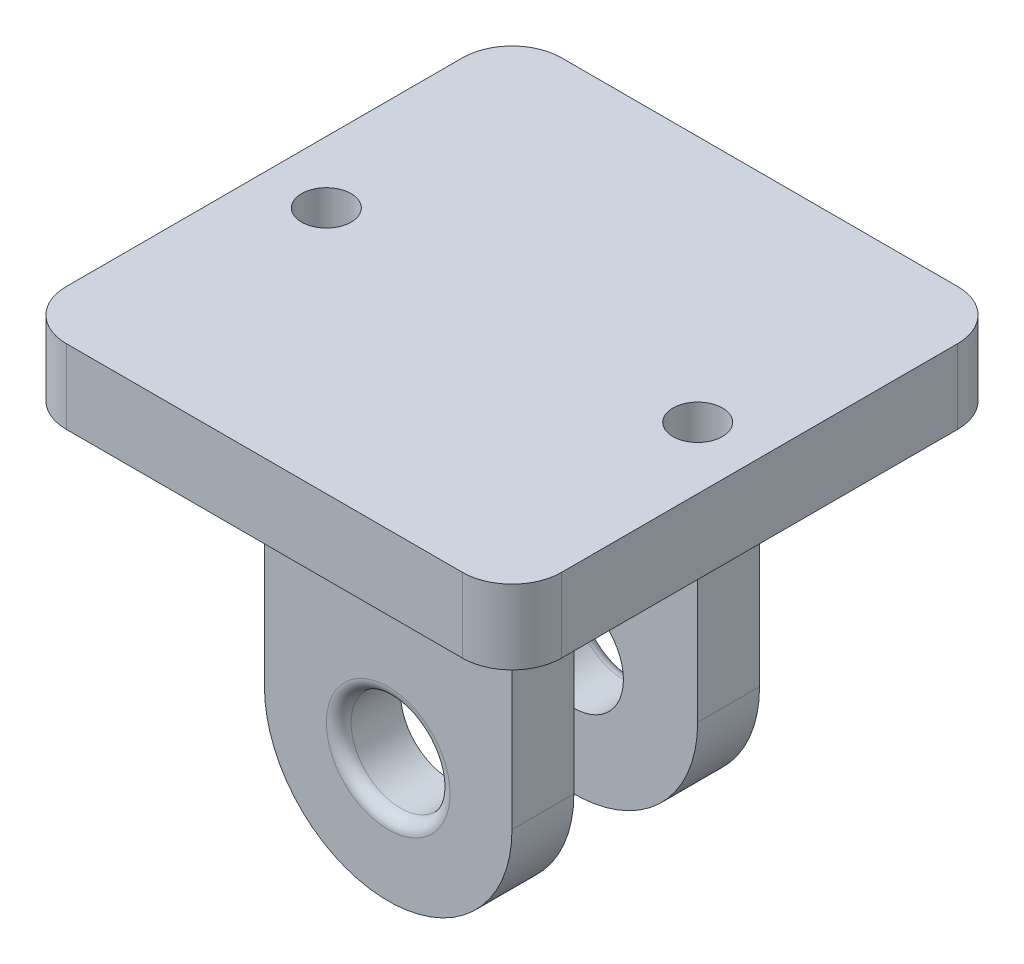
ISO-10303-21;
HEADER;
FILE_DESCRIPTION(('STEP AP214'),'2;1');
FILE_NAME('part.step','',(''),(''),'','','');
FILE_SCHEMA(('AUTOMOTIVE_DESIGN { 1 0 10303 214 1 1 1 1 }'));
ENDSEC;
DATA;
#1=APPLICATION_CONTEXT('core data for automotive mechanical design processes');
#2=APPLICATION_PROTOCOL_DEFINITION('international standard','automotive_design',2000,#1);
#3=PRODUCT_CONTEXT('',#1,'mechanical');
#4=PRODUCT('Part','Part','',(#3));
#5=PRODUCT_RELATED_PRODUCT_CATEGORY('part','',(#4));
#6=PRODUCT_DEFINITION_FORMATION('','',#4);
#7=PRODUCT_DEFINITION_CONTEXT('part definition',#1,'design');
#8=PRODUCT_DEFINITION('design','',#6,#7);
#9=PRODUCT_DEFINITION_SHAPE('','',#8);
#10=(LENGTH_UNIT() NAMED_UNIT(*) SI_UNIT(.MILLI.,.METRE.));
#11=(NAMED_UNIT(*) PLANE_ANGLE_UNIT() SI_UNIT($,.RADIAN.));
#12=(NAMED_UNIT(*) SI_UNIT($,.STERADIAN.) SOLID_ANGLE_UNIT());
#13=UNCERTAINTY_MEASURE_WITH_UNIT(LENGTH_MEASURE(1.E-05),#10,'distance_accuracy_value','');
#14=(GEOMETRIC_REPRESENTATION_CONTEXT(3) GLOBAL_UNCERTAINTY_ASSIGNED_CONTEXT((#13)) GLOBAL_UNIT_ASSIGNED_CONTEXT((#10,
#11,#12)) REPRESENTATION_CONTEXT('',''));
#15=CARTESIAN_POINT('',(0.,0.,0.));
#16=DIRECTION('',(0.,0.,1.));
#17=DIRECTION('',(1.,0.,0.));
#18=AXIS2_PLACEMENT_3D('',#15,#16,#17);
#19=CARTESIAN_POINT('',(0.,-2.49999999999999,0.));
#20=DIRECTION('',(0.,0.,-1.));
#21=DIRECTION('',(-1.,0.,0.));
#22=AXIS2_PLACEMENT_3D('',#19,#20,#21);
#23=CYLINDRICAL_SURFACE('',#22,5.);
#24=CARTESIAN_POINT('',(0.,-2.49999999999999,7.5));
#25=DIRECTION('',(0.,0.,1.));
#26=DIRECTION('',(0.,-1.,0.));
#27=AXIS2_PLACEMENT_3D('',#24,#25,#26);
#28=CIRCLE('',#27,5.);
#29=CARTESIAN_POINT('',(5.,-2.49999999999999,7.5));
#30=VERTEX_POINT('',#29);
#31=CARTESIAN_POINT('',(-5.,-2.49999999999999,7.5));
#32=VERTEX_POINT('',#31);
#33=EDGE_CURVE('E215',#30,#32,#28,.F.);
#34=ORIENTED_EDGE('',*,*,#33,.F.);
#35=DIRECTION('',(0.,0.,-1.));
#36=VECTOR('',#35,1.);
#37=CARTESIAN_POINT('',(5.,-2.49999999999999,10.));
#38=LINE('',#37,#36);
#39=CARTESIAN_POINT('',(5.,-2.49999999999999,10.));
#40=VERTEX_POINT('',#39);
#41=EDGE_CURVE('E230',#40,#30,#38,.T.);
#42=ORIENTED_EDGE('',*,*,#41,.F.);
#43=CARTESIAN_POINT('',(0.,-2.49999999999999,10.));
#44=DIRECTION('',(0.,0.,1.));
#45=DIRECTION('',(1.,0.,0.));
#46=AXIS2_PLACEMENT_3D('',#43,#44,#45);
#47=CIRCLE('',#46,5.);
#48=CARTESIAN_POINT('',(-5.,-2.49999999999999,10.));
#49=VERTEX_POINT('',#48);
#50=EDGE_CURVE('E236',#49,#40,#47,.T.);
#51=ORIENTED_EDGE('',*,*,#50,.F.);
#52=DIRECTION('',(0.,0.,-1.));
#53=VECTOR('',#52,1.);
#54=CARTESIAN_POINT('',(-5.,-2.49999999999999,10.));
#55=LINE('',#54,#53);
#56=EDGE_CURVE('E223',#32,#49,#55,.F.);
#57=ORIENTED_EDGE('',*,*,#56,.F.);
#58=EDGE_LOOP('',(#34,#42,#51,#57));
#59=FACE_BOUND('',#58,.T.);
#60=ADVANCED_FACE('F39',(#59),#23,.T.);
#61=CARTESIAN_POINT('',(0.,-2.49999999999999,2.5));
#62=DIRECTION('',(0.,0.,-1.));
#63=DIRECTION('',(0.,1.,0.));
#64=AXIS2_PLACEMENT_3D('',#61,#62,#63);
#65=CIRCLE('',#64,5.);
#66=CARTESIAN_POINT('',(-5.,-2.5,2.5));
#67=VERTEX_POINT('',#66);
#68=CARTESIAN_POINT('',(5.,-2.5,2.5));
#69=VERTEX_POINT('',#68);
#70=EDGE_CURVE('E212',#67,#69,#65,.F.);
#71=ORIENTED_EDGE('',*,*,#70,.F.);
#72=CARTESIAN_POINT('',(-5.,-2.49999999999999,0.));
#73=VERTEX_POINT('',#72);
#74=EDGE_CURVE('E226',#73,#67,#55,.F.);
#75=ORIENTED_EDGE('',*,*,#74,.F.);
#76=CARTESIAN_POINT('',(0.,-2.49999999999999,0.));
#77=DIRECTION('',(0.,0.,1.));
#78=DIRECTION('',(1.,0.,0.));
#79=AXIS2_PLACEMENT_3D('',#76,#77,#78);
#80=CIRCLE('',#79,5.);
#81=CARTESIAN_POINT('',(5.,-2.49999999999999,0.));
#82=VERTEX_POINT('',#81);
#83=EDGE_CURVE('E233',#82,#73,#80,.F.);
#84=ORIENTED_EDGE('',*,*,#83,.F.);
#85=EDGE_CURVE('E229',#69,#82,#38,.T.);
#86=ORIENTED_EDGE('',*,*,#85,.F.);
#87=EDGE_LOOP('',(#71,#75,#84,#86));
#88=FACE_BOUND('',#87,.T.);
#89=ADVANCED_FACE('F308',(#88),#23,.T.);
#90=CARTESIAN_POINT('',(5.,7.5,10.));
#91=DIRECTION('',(-1.,0.,0.));
#92=DIRECTION('',(0.,-1.,0.));
#93=AXIS2_PLACEMENT_3D('',#90,#91,#92);
#94=PLANE('',#93);
#95=DIRECTION('',(0.,1.,0.));
#96=VECTOR('',#95,1.);
#97=CARTESIAN_POINT('',(5.,7.5,0.));
#98=LINE('',#97,#96);
#99=CARTESIAN_POINT('',(5.,7.,0.));
#100=VERTEX_POINT('',#99);
#101=EDGE_CURVE('E217',#82,#100,#98,.T.);
#102=ORIENTED_EDGE('',*,*,#101,.T.);
#103=DIRECTION('',(0.,0.,-1.));
#104=VECTOR('',#103,1.);
#105=CARTESIAN_POINT('',(5.,7.,10.));
#106=LINE('',#105,#104);
#107=CARTESIAN_POINT('',(5.,7.,10.));
#108=VERTEX_POINT('',#107);
#109=EDGE_CURVE('E48',#100,#108,#106,.F.);
#110=ORIENTED_EDGE('',*,*,#109,.T.);
#111=DIRECTION('',(0.,1.,0.));
#112=VECTOR('',#111,1.);
#113=CARTESIAN_POINT('',(5.,7.5,10.));
#114=LINE('',#113,#112);
#115=EDGE_CURVE('E218',#40,#108,#114,.T.);
#116=ORIENTED_EDGE('',*,*,#115,.F.);
#117=ORIENTED_EDGE('',*,*,#41,.T.);
#118=DIRECTION('',(0.,1.,0.));
#119=VECTOR('',#118,1.);
#120=CARTESIAN_POINT('',(5.,4.5,7.5));
#121=LINE('',#120,#119);
#122=CARTESIAN_POINT('',(5.,4.5,7.5));
#123=VERTEX_POINT('',#122);
#124=EDGE_CURVE('E199',#30,#123,#121,.T.);
#125=ORIENTED_EDGE('',*,*,#124,.T.);
#126=DIRECTION('',(0.,0.,-1.));
#127=VECTOR('',#126,1.);
#128=CARTESIAN_POINT('',(5.,4.5,2.5));
#129=LINE('',#128,#127);
#130=CARTESIAN_POINT('',(5.,4.5,2.5));
#131=VERTEX_POINT('',#130);
#132=EDGE_CURVE('E202',#123,#131,#129,.T.);
#133=ORIENTED_EDGE('',*,*,#132,.T.);
#134=DIRECTION('',(0.,-1.,0.));
#135=VECTOR('',#134,1.);
#136=CARTESIAN_POINT('',(5.,4.5,2.5));
#137=LINE('',#136,#135);
#138=EDGE_CURVE('E205',#131,#69,#137,.T.);
#139=ORIENTED_EDGE('',*,*,#138,.T.);
#140=ORIENTED_EDGE('',*,*,#85,.T.);
#141=EDGE_LOOP('',(#102,#110,#116,#117,#125,#133,#139,#140));
#142=FACE_BOUND('',#141,.T.);
#143=ADVANCED_FACE('F327',(#142),#94,.F.);
#144=CARTESIAN_POINT('',(-5.,7.5,10.));
#145=DIRECTION('',(1.,0.,0.));
#146=DIRECTION('',(0.,1.,0.));
#147=AXIS2_PLACEMENT_3D('',#144,#145,#146);
#148=PLANE('',#147);
#149=DIRECTION('',(0.,-1.,0.));
#150=VECTOR('',#149,1.);
#151=CARTESIAN_POINT('',(-5.,7.5,10.));
#152=LINE('',#151,#150);
#153=CARTESIAN_POINT('',(-5.,7.,10.));
#154=VERTEX_POINT('',#153);
#155=EDGE_CURVE('E220',#154,#49,#152,.T.);
#156=ORIENTED_EDGE('',*,*,#155,.F.);
#157=DIRECTION('',(0.,0.,-1.));
#158=VECTOR('',#157,1.);
#159=CARTESIAN_POINT('',(-5.,7.,0.));
#160=LINE('',#159,#158);
#161=CARTESIAN_POINT('',(-5.,7.,0.));
#162=VERTEX_POINT('',#161);
#163=EDGE_CURVE('E257',#154,#162,#160,.T.);
#164=ORIENTED_EDGE('',*,*,#163,.T.);
#165=DIRECTION('',(0.,-1.,0.));
#166=VECTOR('',#165,1.);
#167=CARTESIAN_POINT('',(-5.,7.5,0.));
#168=LINE('',#167,#166);
#169=EDGE_CURVE('E221',#162,#73,#168,.T.);
#170=ORIENTED_EDGE('',*,*,#169,.T.);
#171=ORIENTED_EDGE('',*,*,#74,.T.);
#172=DIRECTION('',(0.,-1.,0.));
#173=VECTOR('',#172,1.);
#174=CARTESIAN_POINT('',(-5.,4.5,2.5));
#175=LINE('',#174,#173);
#176=CARTESIAN_POINT('',(-5.,4.5,2.5));
#177=VERTEX_POINT('',#176);
#178=EDGE_CURVE('E193',#177,#67,#175,.T.);
#179=ORIENTED_EDGE('',*,*,#178,.F.);
#180=DIRECTION('',(0.,0.,-1.));
#181=VECTOR('',#180,1.);
#182=CARTESIAN_POINT('',(-5.,4.5,2.5));
#183=LINE('',#182,#181);
#184=CARTESIAN_POINT('',(-5.,4.5,7.5));
#185=VERTEX_POINT('',#184);
#186=EDGE_CURVE('E190',#185,#177,#183,.T.);
#187=ORIENTED_EDGE('',*,*,#186,.F.);
#188=DIRECTION('',(0.,-1.,0.));
#189=VECTOR('',#188,1.);
#190=CARTESIAN_POINT('',(-5.,7.5,7.5));
#191=LINE('',#190,#189);
#192=EDGE_CURVE('E238',#185,#32,#191,.T.);
#193=ORIENTED_EDGE('',*,*,#192,.T.);
#194=ORIENTED_EDGE('',*,*,#56,.T.);
#195=EDGE_LOOP('',(#156,#164,#170,#171,#179,#187,#193,#194));
#196=FACE_BOUND('',#195,.T.);
#197=ADVANCED_FACE('F300',(#196),#148,.F.);
#198=CARTESIAN_POINT('',(0.,0.,10.));
#199=DIRECTION('',(0.,0.,1.));
#200=DIRECTION('',(1.,0.,0.));
#201=AXIS2_PLACEMENT_3D('',#198,#199,#200);
#202=PLANE('',#201);
#203=CARTESIAN_POINT('',(0.,-2.49999999999999,10.));
#204=DIRECTION('',(0.,0.,1.));
#205=DIRECTION('',(1.,0.,0.));
#206=AXIS2_PLACEMENT_3D('',#203,#204,#205);
#207=CIRCLE('',#206,2.5);
#208=CARTESIAN_POINT('',(2.5,-2.49999999999999,10.));
#209=VERTEX_POINT('',#208);
#210=EDGE_CURVE('E248',#209,#209,#207,.F.);
#211=ORIENTED_EDGE('',*,*,#210,.T.);
#212=EDGE_LOOP('',(#211));
#213=FACE_BOUND('',#212,.T.);
#214=ORIENTED_EDGE('',*,*,#115,.T.);
#215=DIRECTION('',(-1.,0.,0.));
#216=VECTOR('',#215,1.);
#217=CARTESIAN_POINT('',(0.,7.,10.));
#218=LINE('',#217,#216);
#219=EDGE_CURVE('E269',#108,#154,#218,.T.);
#220=ORIENTED_EDGE('',*,*,#219,.T.);
#221=ORIENTED_EDGE('',*,*,#155,.T.);
#222=ORIENTED_EDGE('',*,*,#50,.T.);
#223=EDGE_LOOP('',(#214,#220,#221,#222));
#224=FACE_BOUND('',#223,.T.);
#225=ADVANCED_FACE('F326',(#213,#224),#202,.T.);
#226=CARTESIAN_POINT('',(0.,0.,0.));
#227=DIRECTION('',(0.,0.,1.));
#228=DIRECTION('',(1.,0.,0.));
#229=AXIS2_PLACEMENT_3D('',#226,#227,#228);
#230=PLANE('',#229);
#231=CARTESIAN_POINT('',(0.,-2.49999999999999,0.));
#232=DIRECTION('',(0.,0.,1.));
#233=DIRECTION('',(1.,0.,0.));
#234=AXIS2_PLACEMENT_3D('',#231,#232,#233);
#235=CIRCLE('',#234,2.5);
#236=CARTESIAN_POINT('',(2.5,-2.49999999999999,0.));
#237=VERTEX_POINT('',#236);
#238=EDGE_CURVE('E251',#237,#237,#235,.T.);
#239=ORIENTED_EDGE('',*,*,#238,.T.);
#240=EDGE_LOOP('',(#239));
#241=FACE_BOUND('',#240,.T.);
#242=ORIENTED_EDGE('',*,*,#169,.F.);
#243=DIRECTION('',(-1.,0.,0.));
#244=VECTOR('',#243,1.);
#245=CARTESIAN_POINT('',(5.,7.,0.));
#246=LINE('',#245,#244);
#247=EDGE_CURVE('E11',#162,#100,#246,.F.);
#248=ORIENTED_EDGE('',*,*,#247,.T.);
#249=ORIENTED_EDGE('',*,*,#101,.F.);
#250=ORIENTED_EDGE('',*,*,#83,.T.);
#251=EDGE_LOOP('',(#242,#248,#249,#250));
#252=FACE_BOUND('',#251,.T.);
#253=ADVANCED_FACE('F302',(#241,#252),#230,.F.);
#254=CARTESIAN_POINT('',(5.,4.5,7.5));
#255=DIRECTION('',(0.,0.,1.));
#256=DIRECTION('',(0.,-1.,0.));
#257=AXIS2_PLACEMENT_3D('',#254,#255,#256);
#258=PLANE('',#257);
#259=CARTESIAN_POINT('',(0.,-2.49999999999999,7.5));
#260=DIRECTION('',(0.,0.,1.));
#261=DIRECTION('',(0.,-1.,0.));
#262=AXIS2_PLACEMENT_3D('',#259,#260,#261);
#263=CIRCLE('',#262,2.);
#264=CARTESIAN_POINT('',(2.,-2.49999999999999,7.50000000000001));
#265=VERTEX_POINT('',#264);
#266=EDGE_CURVE('E245',#265,#265,#263,.T.);
#267=ORIENTED_EDGE('',*,*,#266,.T.);
#268=EDGE_LOOP('',(#267));
#269=FACE_BOUND('',#268,.T.);
#270=ORIENTED_EDGE('',*,*,#33,.T.);
#271=ORIENTED_EDGE('',*,*,#192,.F.);
#272=DIRECTION('',(-1.,0.,0.));
#273=VECTOR('',#272,1.);
#274=CARTESIAN_POINT('',(5.,4.5,7.5));
#275=LINE('',#274,#273);
#276=EDGE_CURVE('E207',#123,#185,#275,.T.);
#277=ORIENTED_EDGE('',*,*,#276,.F.);
#278=ORIENTED_EDGE('',*,*,#124,.F.);
#279=EDGE_LOOP('',(#270,#271,#277,#278));
#280=FACE_BOUND('',#279,.T.);
#281=ADVANCED_FACE('F320',(#269,#280),#258,.F.);
#282=CARTESIAN_POINT('',(5.,4.5,2.5));
#283=DIRECTION('',(0.,0.,-1.));
#284=DIRECTION('',(0.,1.,0.));
#285=AXIS2_PLACEMENT_3D('',#282,#283,#284);
#286=PLANE('',#285);
#287=CARTESIAN_POINT('',(0.,-2.49999999999999,2.5));
#288=DIRECTION('',(0.,0.,-1.));
#289=DIRECTION('',(0.,1.,0.));
#290=AXIS2_PLACEMENT_3D('',#287,#288,#289);
#291=CIRCLE('',#290,2.);
#292=CARTESIAN_POINT('',(2.,-2.49999999999999,2.5));
#293=VERTEX_POINT('',#292);
#294=EDGE_CURVE('E242',#293,#293,#291,.T.);
#295=ORIENTED_EDGE('',*,*,#294,.T.);
#296=EDGE_LOOP('',(#295));
#297=FACE_BOUND('',#296,.T.);
#298=ORIENTED_EDGE('',*,*,#70,.T.);
#299=ORIENTED_EDGE('',*,*,#138,.F.);
#300=DIRECTION('',(-1.,0.,0.));
#301=VECTOR('',#300,1.);
#302=CARTESIAN_POINT('',(5.,4.5,2.5));
#303=LINE('',#302,#301);
#304=EDGE_CURVE('E210',#131,#177,#303,.T.);
#305=ORIENTED_EDGE('',*,*,#304,.T.);
#306=ORIENTED_EDGE('',*,*,#178,.T.);
#307=EDGE_LOOP('',(#298,#299,#305,#306));
#308=FACE_BOUND('',#307,.T.);
#309=ADVANCED_FACE('F312',(#297,#308),#286,.F.);
#310=CARTESIAN_POINT('',(5.,4.5,2.5));
#311=DIRECTION('',(0.,1.,0.));
#312=DIRECTION('',(-1.,0.,0.));
#313=AXIS2_PLACEMENT_3D('',#310,#311,#312);
#314=PLANE('',#313);
#315=ORIENTED_EDGE('',*,*,#186,.T.);
#316=ORIENTED_EDGE('',*,*,#304,.F.);
#317=ORIENTED_EDGE('',*,*,#132,.F.);
#318=ORIENTED_EDGE('',*,*,#276,.T.);
#319=EDGE_LOOP('',(#315,#316,#317,#318));
#320=FACE_BOUND('',#319,.T.);
#321=ADVANCED_FACE('F316',(#320),#314,.F.);
#322=CARTESIAN_POINT('',(0.,7.5,0.));
#323=DIRECTION('',(0.,1.,0.));
#324=DIRECTION('',(0.,0.,1.));
#325=AXIS2_PLACEMENT_3D('',#322,#323,#324);
#326=PLANE('',#325);
#327=DIRECTION('',(-1.,0.,0.));
#328=VECTOR('',#327,1.);
#329=CARTESIAN_POINT('',(-5.,7.5,-0.5));
#330=LINE('',#329,#328);
#331=CARTESIAN_POINT('',(5.5,7.5,-0.5));
#332=VERTEX_POINT('',#331);
#333=CARTESIAN_POINT('',(-5.5,7.5,-0.5));
#334=VERTEX_POINT('',#333);
#335=EDGE_CURVE('E260',#332,#334,#330,.T.);
#336=ORIENTED_EDGE('',*,*,#335,.T.);
#337=DIRECTION('',(0.,0.,-1.));
#338=VECTOR('',#337,1.);
#339=CARTESIAN_POINT('',(-5.5,7.5,10.));
#340=LINE('',#339,#338);
#341=CARTESIAN_POINT('',(-5.5,7.5,10.5));
#342=VERTEX_POINT('',#341);
#343=EDGE_CURVE('E266',#334,#342,#340,.F.);
#344=ORIENTED_EDGE('',*,*,#343,.T.);
#345=DIRECTION('',(-1.,0.,0.));
#346=VECTOR('',#345,1.);
#347=CARTESIAN_POINT('',(0.,7.5,10.5));
#348=LINE('',#347,#346);
#349=CARTESIAN_POINT('',(5.5,7.5,10.5));
#350=VERTEX_POINT('',#349);
#351=EDGE_CURVE('E264',#342,#350,#348,.F.);
#352=ORIENTED_EDGE('',*,*,#351,.T.);
#353=DIRECTION('',(0.,0.,-1.));
#354=VECTOR('',#353,1.);
#355=CARTESIAN_POINT('',(5.5,7.5,0.));
#356=LINE('',#355,#354);
#357=EDGE_CURVE('E262',#350,#332,#356,.T.);
#358=ORIENTED_EDGE('',*,*,#357,.T.);
#359=EDGE_LOOP('',(#336,#344,#352,#358));
#360=FACE_BOUND('',#359,.T.);
#361=CARTESIAN_POINT('',(-7.5,7.5,5.));
#362=DIRECTION('',(0.,-1.,0.));
#363=DIRECTION('',(0.,0.,-1.));
#364=AXIS2_PLACEMENT_3D('',#361,#362,#363);
#365=CIRCLE('',#364,1.);
#366=CARTESIAN_POINT('',(-7.5,7.5,4.));
#367=VERTEX_POINT('',#366);
#368=EDGE_CURVE('E559',#367,#367,#365,.T.);
#369=ORIENTED_EDGE('',*,*,#368,.F.);
#370=EDGE_LOOP('',(#369));
#371=FACE_BOUND('',#370,.T.);
#372=CARTESIAN_POINT('',(7.5,7.5,5.));
#373=DIRECTION('',(0.,-1.,0.));
#374=DIRECTION('',(0.,0.,-1.));
#375=AXIS2_PLACEMENT_3D('',#372,#373,#374);
#376=CIRCLE('',#375,1.);
#377=CARTESIAN_POINT('',(7.5,7.5,4.));
#378=VERTEX_POINT('',#377);
#379=EDGE_CURVE('E550',#378,#378,#376,.T.);
#380=ORIENTED_EDGE('',*,*,#379,.F.);
#381=EDGE_LOOP('',(#380));
#382=FACE_BOUND('',#381,.T.);
#383=DIRECTION('',(-1.,0.,0.));
#384=VECTOR('',#383,1.);
#385=CARTESIAN_POINT('',(0.,7.5,-5.));
#386=LINE('',#385,#384);
#387=CARTESIAN_POINT('',(7.99999999999998,7.5,-5.));
#388=VERTEX_POINT('',#387);
#389=CARTESIAN_POINT('',(-7.99999999999999,7.5,-5.));
#390=VERTEX_POINT('',#389);
#391=EDGE_CURVE('E189',#388,#390,#386,.T.);
#392=ORIENTED_EDGE('',*,*,#391,.F.);
#393=CARTESIAN_POINT('',(8.,7.5,-3.));
#394=DIRECTION('',(0.,1.,0.));
#395=DIRECTION('',(0.,0.,1.));
#396=AXIS2_PLACEMENT_3D('',#393,#394,#395);
#397=CIRCLE('',#396,2.);
#398=CARTESIAN_POINT('',(10.,7.5,-2.99999999999999));
#399=VERTEX_POINT('',#398);
#400=EDGE_CURVE('E185',#388,#399,#397,.F.);
#401=ORIENTED_EDGE('',*,*,#400,.T.);
#402=DIRECTION('',(0.,0.,-1.));
#403=VECTOR('',#402,1.);
#404=CARTESIAN_POINT('',(10.,7.5,0.));
#405=LINE('',#404,#403);
#406=CARTESIAN_POINT('',(10.,7.5,13.));
#407=VERTEX_POINT('',#406);
#408=EDGE_CURVE('E586',#407,#399,#405,.T.);
#409=ORIENTED_EDGE('',*,*,#408,.F.);
#410=CARTESIAN_POINT('',(8.,7.5,13.));
#411=DIRECTION('',(0.,1.,0.));
#412=DIRECTION('',(0.,0.,1.));
#413=AXIS2_PLACEMENT_3D('',#410,#411,#412);
#414=CIRCLE('',#413,2.);
#415=CARTESIAN_POINT('',(7.99999999999998,7.5,15.));
#416=VERTEX_POINT('',#415);
#417=EDGE_CURVE('E584',#416,#407,#414,.T.);
#418=ORIENTED_EDGE('',*,*,#417,.F.);
#419=DIRECTION('',(1.,0.,0.));
#420=VECTOR('',#419,1.);
#421=CARTESIAN_POINT('',(0.,7.5,15.));
#422=LINE('',#421,#420);
#423=CARTESIAN_POINT('',(-7.99999999999999,7.5,15.));
#424=VERTEX_POINT('',#423);
#425=EDGE_CURVE('E582',#424,#416,#422,.T.);
#426=ORIENTED_EDGE('',*,*,#425,.F.);
#427=CARTESIAN_POINT('',(-8.,7.5,13.));
#428=DIRECTION('',(0.,1.,0.));
#429=DIRECTION('',(0.,0.,1.));
#430=AXIS2_PLACEMENT_3D('',#427,#428,#429);
#431=CIRCLE('',#430,2.);
#432=CARTESIAN_POINT('',(-10.,7.5,13.));
#433=VERTEX_POINT('',#432);
#434=EDGE_CURVE('E580',#433,#424,#431,.T.);
#435=ORIENTED_EDGE('',*,*,#434,.F.);
#436=DIRECTION('',(0.,0.,1.));
#437=VECTOR('',#436,1.);
#438=CARTESIAN_POINT('',(-10.,7.5,0.));
#439=LINE('',#438,#437);
#440=CARTESIAN_POINT('',(-10.,7.5,-2.99999999999998));
#441=VERTEX_POINT('',#440);
#442=EDGE_CURVE('E578',#441,#433,#439,.T.);
#443=ORIENTED_EDGE('',*,*,#442,.F.);
#444=CARTESIAN_POINT('',(-8.,7.5,-3.));
#445=DIRECTION('',(0.,1.,0.));
#446=DIRECTION('',(0.,0.,1.));
#447=AXIS2_PLACEMENT_3D('',#444,#445,#446);
#448=CIRCLE('',#447,2.);
#449=EDGE_CURVE('E576',#390,#441,#448,.T.);
#450=ORIENTED_EDGE('',*,*,#449,.F.);
#451=EDGE_LOOP('',(#392,#401,#409,#418,#426,#435,#443,#450));
#452=FACE_BOUND('',#451,.T.);
#453=ADVANCED_FACE('F290',(#360,#371,#382,#452),#326,.F.);
#454=CARTESIAN_POINT('',(0.,10.5,-5.));
#455=DIRECTION('',(0.,0.,1.));
#456=DIRECTION('',(1.,0.,0.));
#457=AXIS2_PLACEMENT_3D('',#454,#455,#456);
#458=PLANE('',#457);
#459=ORIENTED_EDGE('',*,*,#391,.T.);
#460=DIRECTION('',(0.,-1.,0.));
#461=VECTOR('',#460,1.);
#462=CARTESIAN_POINT('',(-7.99999999999999,10.5,-5.));
#463=LINE('',#462,#461);
#464=CARTESIAN_POINT('',(-7.99999999999999,10.5,-5.));
#465=VERTEX_POINT('',#464);
#466=EDGE_CURVE('E170',#465,#390,#463,.T.);
#467=ORIENTED_EDGE('',*,*,#466,.F.);
#468=DIRECTION('',(-1.,0.,0.));
#469=VECTOR('',#468,1.);
#470=CARTESIAN_POINT('',(0.,10.5,-5.));
#471=LINE('',#470,#469);
#472=CARTESIAN_POINT('',(7.99999999999998,10.5,-5.));
#473=VERTEX_POINT('',#472);
#474=EDGE_CURVE('E177',#473,#465,#471,.T.);
#475=ORIENTED_EDGE('',*,*,#474,.F.);
#476=DIRECTION('',(0.,-1.,0.));
#477=VECTOR('',#476,1.);
#478=CARTESIAN_POINT('',(7.99999999999998,10.5,-5.));
#479=LINE('',#478,#477);
#480=EDGE_CURVE('E574',#473,#388,#479,.T.);
#481=ORIENTED_EDGE('',*,*,#480,.T.);
#482=EDGE_LOOP('',(#459,#467,#475,#481));
#483=FACE_BOUND('',#482,.T.);
#484=ADVANCED_FACE('F187',(#483),#458,.F.);
#485=CARTESIAN_POINT('',(-8.,10.5,-3.));
#486=DIRECTION('',(0.,-1.,0.));
#487=DIRECTION('',(0.,0.,-1.));
#488=AXIS2_PLACEMENT_3D('',#485,#486,#487);
#489=CYLINDRICAL_SURFACE('',#488,2.);
#490=ORIENTED_EDGE('',*,*,#449,.T.);
#491=DIRECTION('',(0.,-1.,0.));
#492=VECTOR('',#491,1.);
#493=CARTESIAN_POINT('',(-10.,10.5,-2.99999999999998));
#494=LINE('',#493,#492);
#495=CARTESIAN_POINT('',(-10.,10.5,-2.99999999999998));
#496=VERTEX_POINT('',#495);
#497=EDGE_CURVE('E173',#496,#441,#494,.T.);
#498=ORIENTED_EDGE('',*,*,#497,.F.);
#499=CARTESIAN_POINT('',(-8.,10.5,-3.));
#500=DIRECTION('',(0.,1.,0.));
#501=DIRECTION('',(0.,0.,1.));
#502=AXIS2_PLACEMENT_3D('',#499,#500,#501);
#503=CIRCLE('',#502,2.);
#504=EDGE_CURVE('E166',#465,#496,#503,.T.);
#505=ORIENTED_EDGE('',*,*,#504,.F.);
#506=ORIENTED_EDGE('',*,*,#466,.T.);
#507=EDGE_LOOP('',(#490,#498,#505,#506));
#508=FACE_BOUND('',#507,.T.);
#509=ADVANCED_FACE('F168',(#508),#489,.T.);
#510=CARTESIAN_POINT('',(-10.,10.5,0.));
#511=DIRECTION('',(1.,0.,0.));
#512=DIRECTION('',(0.,0.,-1.));
#513=AXIS2_PLACEMENT_3D('',#510,#511,#512);
#514=PLANE('',#513);
#515=ORIENTED_EDGE('',*,*,#442,.T.);
#516=DIRECTION('',(0.,-1.,0.));
#517=VECTOR('',#516,1.);
#518=CARTESIAN_POINT('',(-10.,10.5,13.));
#519=LINE('',#518,#517);
#520=CARTESIAN_POINT('',(-10.,10.5,13.));
#521=VERTEX_POINT('',#520);
#522=EDGE_CURVE('E195',#521,#433,#519,.T.);
#523=ORIENTED_EDGE('',*,*,#522,.F.);
#524=DIRECTION('',(0.,0.,1.));
#525=VECTOR('',#524,1.);
#526=CARTESIAN_POINT('',(-10.,10.5,0.));
#527=LINE('',#526,#525);
#528=EDGE_CURVE('E176',#496,#521,#527,.T.);
#529=ORIENTED_EDGE('',*,*,#528,.F.);
#530=ORIENTED_EDGE('',*,*,#497,.T.);
#531=EDGE_LOOP('',(#515,#523,#529,#530));
#532=FACE_BOUND('',#531,.T.);
#533=ADVANCED_FACE('F452',(#532),#514,.F.);
#534=CARTESIAN_POINT('',(-8.,10.5,13.));
#535=DIRECTION('',(0.,-1.,0.));
#536=DIRECTION('',(0.,0.,-1.));
#537=AXIS2_PLACEMENT_3D('',#534,#535,#536);
#538=CYLINDRICAL_SURFACE('',#537,2.);
#539=ORIENTED_EDGE('',*,*,#434,.T.);
#540=DIRECTION('',(0.,-1.,0.));
#541=VECTOR('',#540,1.);
#542=CARTESIAN_POINT('',(-7.99999999999999,10.5,15.));
#543=LINE('',#542,#541);
#544=CARTESIAN_POINT('',(-7.99999999999999,10.5,15.));
#545=VERTEX_POINT('',#544);
#546=EDGE_CURVE('E600',#545,#424,#543,.T.);
#547=ORIENTED_EDGE('',*,*,#546,.F.);
#548=CARTESIAN_POINT('',(-8.,10.5,13.));
#549=DIRECTION('',(0.,1.,0.));
#550=DIRECTION('',(0.,0.,1.));
#551=AXIS2_PLACEMENT_3D('',#548,#549,#550);
#552=CIRCLE('',#551,2.);
#553=EDGE_CURVE('E565',#521,#545,#552,.T.);
#554=ORIENTED_EDGE('',*,*,#553,.F.);
#555=ORIENTED_EDGE('',*,*,#522,.T.);
#556=EDGE_LOOP('',(#539,#547,#554,#555));
#557=FACE_BOUND('',#556,.T.);
#558=ADVANCED_FACE('F444',(#557),#538,.T.);
#559=CARTESIAN_POINT('',(0.,10.5,15.));
#560=DIRECTION('',(0.,0.,-1.));
#561=DIRECTION('',(-1.,0.,0.));
#562=AXIS2_PLACEMENT_3D('',#559,#560,#561);
#563=PLANE('',#562);
#564=ORIENTED_EDGE('',*,*,#425,.T.);
#565=DIRECTION('',(0.,-1.,0.));
#566=VECTOR('',#565,1.);
#567=CARTESIAN_POINT('',(7.99999999999998,10.5,15.));
#568=LINE('',#567,#566);
#569=CARTESIAN_POINT('',(7.99999999999998,10.5,15.));
#570=VERTEX_POINT('',#569);
#571=EDGE_CURVE('E597',#570,#416,#568,.T.);
#572=ORIENTED_EDGE('',*,*,#571,.F.);
#573=DIRECTION('',(1.,0.,0.));
#574=VECTOR('',#573,1.);
#575=CARTESIAN_POINT('',(0.,10.5,15.));
#576=LINE('',#575,#574);
#577=EDGE_CURVE('E567',#545,#570,#576,.T.);
#578=ORIENTED_EDGE('',*,*,#577,.F.);
#579=ORIENTED_EDGE('',*,*,#546,.T.);
#580=EDGE_LOOP('',(#564,#572,#578,#579));
#581=FACE_BOUND('',#580,.T.);
#582=ADVANCED_FACE('F436',(#581),#563,.F.);
#583=CARTESIAN_POINT('',(8.,10.5,13.));
#584=DIRECTION('',(0.,-1.,0.));
#585=DIRECTION('',(0.,0.,-1.));
#586=AXIS2_PLACEMENT_3D('',#583,#584,#585);
#587=CYLINDRICAL_SURFACE('',#586,2.);
#588=ORIENTED_EDGE('',*,*,#417,.T.);
#589=DIRECTION('',(0.,-1.,0.));
#590=VECTOR('',#589,1.);
#591=CARTESIAN_POINT('',(10.,10.5,13.));
#592=LINE('',#591,#590);
#593=CARTESIAN_POINT('',(10.,10.5,13.));
#594=VERTEX_POINT('',#593);
#595=EDGE_CURVE('E594',#594,#407,#592,.T.);
#596=ORIENTED_EDGE('',*,*,#595,.F.);
#597=CARTESIAN_POINT('',(8.,10.5,13.));
#598=DIRECTION('',(0.,1.,0.));
#599=DIRECTION('',(0.,0.,1.));
#600=AXIS2_PLACEMENT_3D('',#597,#598,#599);
#601=CIRCLE('',#600,2.);
#602=EDGE_CURVE('E569',#570,#594,#601,.T.);
#603=ORIENTED_EDGE('',*,*,#602,.F.);
#604=ORIENTED_EDGE('',*,*,#571,.T.);
#605=EDGE_LOOP('',(#588,#596,#603,#604));
#606=FACE_BOUND('',#605,.T.);
#607=ADVANCED_FACE('F428',(#606),#587,.T.);
#608=CARTESIAN_POINT('',(10.,10.5,0.));
#609=DIRECTION('',(-1.,0.,0.));
#610=DIRECTION('',(0.,0.,1.));
#611=AXIS2_PLACEMENT_3D('',#608,#609,#610);
#612=PLANE('',#611);
#613=ORIENTED_EDGE('',*,*,#408,.T.);
#614=DIRECTION('',(0.,-1.,0.));
#615=VECTOR('',#614,1.);
#616=CARTESIAN_POINT('',(10.,10.5,-2.99999999999999));
#617=LINE('',#616,#615);
#618=CARTESIAN_POINT('',(10.,10.5,-2.99999999999999));
#619=VERTEX_POINT('',#618);
#620=EDGE_CURVE('E592',#619,#399,#617,.T.);
#621=ORIENTED_EDGE('',*,*,#620,.F.);
#622=DIRECTION('',(0.,0.,-1.));
#623=VECTOR('',#622,1.);
#624=CARTESIAN_POINT('',(10.,10.5,0.));
#625=LINE('',#624,#623);
#626=EDGE_CURVE('E571',#594,#619,#625,.T.);
#627=ORIENTED_EDGE('',*,*,#626,.F.);
#628=ORIENTED_EDGE('',*,*,#595,.T.);
#629=EDGE_LOOP('',(#613,#621,#627,#628));
#630=FACE_BOUND('',#629,.T.);
#631=ADVANCED_FACE('F420',(#630),#612,.F.);
#632=CARTESIAN_POINT('',(8.,10.5,-3.));
#633=DIRECTION('',(0.,-1.,0.));
#634=DIRECTION('',(0.,0.,-1.));
#635=AXIS2_PLACEMENT_3D('',#632,#633,#634);
#636=CYLINDRICAL_SURFACE('',#635,2.);
#637=ORIENTED_EDGE('',*,*,#400,.F.);
#638=ORIENTED_EDGE('',*,*,#480,.F.);
#639=CARTESIAN_POINT('',(8.,10.5,-3.));
#640=DIRECTION('',(0.,1.,0.));
#641=DIRECTION('',(0.,0.,1.));
#642=AXIS2_PLACEMENT_3D('',#639,#640,#641);
#643=CIRCLE('',#642,2.);
#644=EDGE_CURVE('E183',#473,#619,#643,.F.);
#645=ORIENTED_EDGE('',*,*,#644,.T.);
#646=ORIENTED_EDGE('',*,*,#620,.T.);
#647=EDGE_LOOP('',(#637,#638,#645,#646));
#648=FACE_BOUND('',#647,.T.);
#649=ADVANCED_FACE('F412',(#648),#636,.T.);
#650=CARTESIAN_POINT('',(0.,10.5,0.));
#651=DIRECTION('',(0.,1.,0.));
#652=DIRECTION('',(0.,0.,1.));
#653=AXIS2_PLACEMENT_3D('',#650,#651,#652);
#654=PLANE('',#653);
#655=CARTESIAN_POINT('',(-7.5,10.5,5.));
#656=DIRECTION('',(0.,-1.,0.));
#657=DIRECTION('',(0.,0.,-1.));
#658=AXIS2_PLACEMENT_3D('',#655,#656,#657);
#659=CIRCLE('',#658,1.);
#660=CARTESIAN_POINT('',(-7.5,10.5,4.));
#661=VERTEX_POINT('',#660);
#662=EDGE_CURVE('E556',#661,#661,#659,.T.);
#663=ORIENTED_EDGE('',*,*,#662,.T.);
#664=EDGE_LOOP('',(#663));
#665=FACE_BOUND('',#664,.T.);
#666=CARTESIAN_POINT('',(7.5,10.5,5.));
#667=DIRECTION('',(0.,-1.,0.));
#668=DIRECTION('',(0.,0.,-1.));
#669=AXIS2_PLACEMENT_3D('',#666,#667,#668);
#670=CIRCLE('',#669,1.);
#671=CARTESIAN_POINT('',(7.5,10.5,4.));
#672=VERTEX_POINT('',#671);
#673=EDGE_CURVE('E553',#672,#672,#670,.T.);
#674=ORIENTED_EDGE('',*,*,#673,.T.);
#675=EDGE_LOOP('',(#674));
#676=FACE_BOUND('',#675,.T.);
#677=ORIENTED_EDGE('',*,*,#474,.T.);
#678=ORIENTED_EDGE('',*,*,#504,.T.);
#679=ORIENTED_EDGE('',*,*,#528,.T.);
#680=ORIENTED_EDGE('',*,*,#553,.T.);
#681=ORIENTED_EDGE('',*,*,#577,.T.);
#682=ORIENTED_EDGE('',*,*,#602,.T.);
#683=ORIENTED_EDGE('',*,*,#626,.T.);
#684=ORIENTED_EDGE('',*,*,#644,.F.);
#685=EDGE_LOOP('',(#677,#678,#679,#680,#681,#682,#683,#684));
#686=FACE_BOUND('',#685,.T.);
#687=ADVANCED_FACE('F181',(#665,#676,#686),#654,.T.);
#688=CARTESIAN_POINT('',(7.5,10.5,5.));
#689=DIRECTION('',(0.,-1.,0.));
#690=DIRECTION('',(0.,0.,-1.));
#691=AXIS2_PLACEMENT_3D('',#688,#689,#690);
#692=CYLINDRICAL_SURFACE('',#691,1.);
#693=ORIENTED_EDGE('',*,*,#673,.F.);
#694=EDGE_LOOP('',(#693));
#695=FACE_BOUND('',#694,.T.);
#696=ORIENTED_EDGE('',*,*,#379,.T.);
#697=EDGE_LOOP('',(#696));
#698=FACE_BOUND('',#697,.T.);
#699=ADVANCED_FACE('F397',(#695,#698),#692,.F.);
#700=CARTESIAN_POINT('',(-7.5,10.5,5.));
#701=DIRECTION('',(0.,-1.,0.));
#702=DIRECTION('',(0.,0.,-1.));
#703=AXIS2_PLACEMENT_3D('',#700,#701,#702);
#704=CYLINDRICAL_SURFACE('',#703,1.);
#705=ORIENTED_EDGE('',*,*,#662,.F.);
#706=EDGE_LOOP('',(#705));
#707=FACE_BOUND('',#706,.T.);
#708=ORIENTED_EDGE('',*,*,#368,.T.);
#709=EDGE_LOOP('',(#708));
#710=FACE_BOUND('',#709,.T.);
#711=ADVANCED_FACE('F387',(#707,#710),#704,.F.);
#712=CARTESIAN_POINT('',(0.,-2.49999999999999,-5.));
#713=DIRECTION('',(0.,0.,1.));
#714=DIRECTION('',(1.,0.,0.));
#715=AXIS2_PLACEMENT_3D('',#712,#713,#714);
#716=CYLINDRICAL_SURFACE('',#715,2.);
#717=CARTESIAN_POINT('',(0.,-2.49999999999999,0.5));
#718=DIRECTION('',(0.,0.,1.));
#719=DIRECTION('',(1.,0.,0.));
#720=AXIS2_PLACEMENT_3D('',#717,#718,#719);
#721=CIRCLE('',#720,2.);
#722=CARTESIAN_POINT('',(2.,-2.49999999999999,0.5));
#723=VERTEX_POINT('',#722);
#724=EDGE_CURVE('E254',#723,#723,#721,.F.);
#725=CARTESIAN_POINT('',(2.,-2.49999999999999,0.5));
#726=CARTESIAN_POINT('',(2.,-2.49999999999999,0.520833333333333));
#727=CARTESIAN_POINT('',(2.,-2.49999999999999,0.541666666666666));
#728=CARTESIAN_POINT('',(2.,-2.49999999999999,0.583333333333333));
#729=CARTESIAN_POINT('',(2.,-2.49999999999999,0.604166666666666));
#730=CARTESIAN_POINT('',(2.,-2.49999999999999,0.645833333333333));
#731=CARTESIAN_POINT('',(2.,-2.49999999999999,0.666666666666666));
#732=CARTESIAN_POINT('',(2.,-2.49999999999999,0.708333333333333));
#733=CARTESIAN_POINT('',(2.,-2.49999999999999,0.729166666666667));
#734=CARTESIAN_POINT('',(2.,-2.49999999999999,0.770833333333333));
#735=CARTESIAN_POINT('',(2.,-2.49999999999999,0.791666666666667));
#736=CARTESIAN_POINT('',(2.,-2.49999999999999,0.833333333333333));
#737=CARTESIAN_POINT('',(2.,-2.49999999999999,0.854166666666667));
#738=CARTESIAN_POINT('',(2.,-2.49999999999999,0.895833333333333));
#739=CARTESIAN_POINT('',(2.,-2.49999999999999,0.916666666666667));
#740=CARTESIAN_POINT('',(2.,-2.49999999999999,0.958333333333333));
#741=CARTESIAN_POINT('',(2.,-2.49999999999999,0.979166666666667));
#742=CARTESIAN_POINT('',(2.,-2.49999999999999,1.02083333333333));
#743=CARTESIAN_POINT('',(2.,-2.49999999999999,1.04166666666667));
#744=CARTESIAN_POINT('',(2.,-2.49999999999999,1.08333333333333));
#745=CARTESIAN_POINT('',(2.,-2.49999999999999,1.10416666666667));
#746=CARTESIAN_POINT('',(2.,-2.49999999999999,1.14583333333333));
#747=CARTESIAN_POINT('',(2.,-2.49999999999999,1.16666666666667));
#748=CARTESIAN_POINT('',(2.,-2.49999999999999,1.20833333333333));
#749=CARTESIAN_POINT('',(2.,-2.49999999999999,1.22916666666667));
#750=CARTESIAN_POINT('',(2.,-2.49999999999999,1.27083333333333));
#751=CARTESIAN_POINT('',(2.,-2.49999999999999,1.29166666666667));
#752=CARTESIAN_POINT('',(2.,-2.49999999999999,1.33333333333333));
#753=CARTESIAN_POINT('',(2.,-2.49999999999999,1.35416666666667));
#754=CARTESIAN_POINT('',(2.,-2.49999999999999,1.39583333333333));
#755=CARTESIAN_POINT('',(2.,-2.49999999999999,1.41666666666667));
#756=CARTESIAN_POINT('',(2.,-2.49999999999999,1.45833333333333));
#757=CARTESIAN_POINT('',(2.,-2.49999999999999,1.47916666666667));
#758=CARTESIAN_POINT('',(2.,-2.49999999999999,1.52083333333333));
#759=CARTESIAN_POINT('',(2.,-2.49999999999999,1.54166666666667));
#760=CARTESIAN_POINT('',(2.,-2.49999999999999,1.58333333333333));
#761=CARTESIAN_POINT('',(2.,-2.49999999999999,1.60416666666667));
#762=CARTESIAN_POINT('',(2.,-2.49999999999999,1.64583333333333));
#763=CARTESIAN_POINT('',(2.,-2.49999999999999,1.66666666666667));
#764=CARTESIAN_POINT('',(2.,-2.49999999999999,1.70833333333333));
#765=CARTESIAN_POINT('',(2.,-2.49999999999999,1.72916666666667));
#766=CARTESIAN_POINT('',(2.,-2.49999999999999,1.77083333333333));
#767=CARTESIAN_POINT('',(2.,-2.49999999999999,1.79166666666667));
#768=CARTESIAN_POINT('',(2.,-2.49999999999999,1.83333333333333));
#769=CARTESIAN_POINT('',(2.,-2.49999999999999,1.85416666666667));
#770=CARTESIAN_POINT('',(2.,-2.49999999999999,1.89583333333333));
#771=CARTESIAN_POINT('',(2.,-2.49999999999999,1.91666666666667));
#772=CARTESIAN_POINT('',(2.,-2.49999999999999,1.95833333333333));
#773=CARTESIAN_POINT('',(2.,-2.49999999999999,1.97916666666667));
#774=CARTESIAN_POINT('',(2.,-2.49999999999999,2.02083333333333));
#775=CARTESIAN_POINT('',(2.,-2.49999999999999,2.04166666666667));
#776=CARTESIAN_POINT('',(2.,-2.49999999999999,2.08333333333333));
#777=CARTESIAN_POINT('',(2.,-2.49999999999999,2.10416666666667));
#778=CARTESIAN_POINT('',(2.,-2.49999999999999,2.14583333333333));
#779=CARTESIAN_POINT('',(2.,-2.49999999999999,2.16666666666667));
#780=CARTESIAN_POINT('',(2.,-2.49999999999999,2.20833333333333));
#781=CARTESIAN_POINT('',(2.,-2.49999999999999,2.22916666666667));
#782=CARTESIAN_POINT('',(2.,-2.49999999999999,2.27083333333333));
#783=CARTESIAN_POINT('',(2.,-2.49999999999999,2.29166666666667));
#784=CARTESIAN_POINT('',(2.,-2.49999999999999,2.33333333333333));
#785=CARTESIAN_POINT('',(2.,-2.49999999999999,2.35416666666667));
#786=CARTESIAN_POINT('',(2.,-2.49999999999999,2.39583333333333));
#787=CARTESIAN_POINT('',(2.,-2.49999999999999,2.41666666666667));
#788=CARTESIAN_POINT('',(2.,-2.49999999999999,2.45833333333333));
#789=CARTESIAN_POINT('',(2.,-2.49999999999999,2.47916666666667));
#790=CARTESIAN_POINT('',(2.,-2.49999999999999,2.5));
#791=B_SPLINE_CURVE_WITH_KNOTS('',3,(#725,#726,#727,#728,#729,#730,#731,#732,#733,#734,#735,
#736,#737,#738,#739,#740,#741,#742,#743,#744,#745,#746,#747,#748,#749,#750,#751,#752,#753,#754,
#755,#756,#757,#758,#759,#760,#761,#762,#763,#764,#765,#766,#767,#768,#769,#770,#771,#772,#773,
#774,#775,#776,#777,#778,#779,#780,#781,#782,#783,#784,#785,#786,#787,#788,#789,#790),
.UNSPECIFIED.,.F.,.F.,(4,2,2,2,2,2,2,2,2,2,2,2,2,2,2,2,2,2,2,2,2,2,2,2,2,2,2,2,2,2,2,2,4),(0.,
0.0625000000000001,0.125,0.1875,0.25,0.3125,0.375,0.4375,0.5,0.5625,0.625000000000001,
0.687500000000001,0.750000000000001,0.812500000000001,0.875000000000001,0.937500000000001,1.,
1.0625,1.125,1.1875,1.25,1.3125,1.375,1.4375,1.5,1.5625,1.625,1.6875,1.75,1.8125,1.875,1.9375,
2.),.UNSPECIFIED.);
#792=EDGE_CURVE('BSEAM377',#723,#293,#791,.T.);
#793=ORIENTED_EDGE('',*,*,#724,.T.);
#794=ORIENTED_EDGE('',*,*,#294,.F.);
#795=ORIENTED_EDGE('',*,*,#792,.T.);
#796=ORIENTED_EDGE('',*,*,#792,.F.);
#797=EDGE_LOOP('',(#793,#795,#794,#796));
#798=FACE_BOUND('',#797,.T.);
#799=ADVANCED_FACE('F377',(#798),#716,.F.);
#800=CARTESIAN_POINT('',(0.,-2.49999999999999,9.5));
#801=DIRECTION('',(0.,0.,1.));
#802=DIRECTION('',(1.,0.,0.));
#803=AXIS2_PLACEMENT_3D('',#800,#801,#802);
#804=CIRCLE('',#803,2.);
#805=CARTESIAN_POINT('',(2.,-2.49999999999999,9.5));
#806=VERTEX_POINT('',#805);
#807=EDGE_CURVE('E241',#806,#806,#804,.T.);
#808=CARTESIAN_POINT('',(2.,-2.49999999999999,9.5));
#809=CARTESIAN_POINT('',(2.,-2.49999999999999,9.47916666666667));
#810=CARTESIAN_POINT('',(2.,-2.49999999999999,9.45833333333333));
#811=CARTESIAN_POINT('',(2.,-2.49999999999999,9.41666666666667));
#812=CARTESIAN_POINT('',(2.,-2.49999999999999,9.39583333333333));
#813=CARTESIAN_POINT('',(2.,-2.49999999999999,9.35416666666667));
#814=CARTESIAN_POINT('',(2.,-2.49999999999999,9.33333333333333));
#815=CARTESIAN_POINT('',(2.,-2.49999999999999,9.29166666666667));
#816=CARTESIAN_POINT('',(2.,-2.49999999999999,9.27083333333333));
#817=CARTESIAN_POINT('',(2.,-2.49999999999999,9.22916666666667));
#818=CARTESIAN_POINT('',(2.,-2.49999999999999,9.20833333333333));
#819=CARTESIAN_POINT('',(2.,-2.49999999999999,9.16666666666667));
#820=CARTESIAN_POINT('',(2.,-2.49999999999999,9.14583333333333));
#821=CARTESIAN_POINT('',(2.,-2.49999999999999,9.10416666666667));
#822=CARTESIAN_POINT('',(2.,-2.49999999999999,9.08333333333333));
#823=CARTESIAN_POINT('',(2.,-2.49999999999999,9.04166666666667));
#824=CARTESIAN_POINT('',(2.,-2.49999999999999,9.02083333333333));
#825=CARTESIAN_POINT('',(2.,-2.49999999999999,8.97916666666667));
#826=CARTESIAN_POINT('',(2.,-2.49999999999999,8.95833333333333));
#827=CARTESIAN_POINT('',(2.,-2.49999999999999,8.91666666666667));
#828=CARTESIAN_POINT('',(2.,-2.49999999999999,8.89583333333333));
#829=CARTESIAN_POINT('',(2.,-2.49999999999999,8.85416666666667));
#830=CARTESIAN_POINT('',(2.,-2.49999999999999,8.83333333333333));
#831=CARTESIAN_POINT('',(2.,-2.49999999999999,8.79166666666667));
#832=CARTESIAN_POINT('',(2.,-2.49999999999999,8.77083333333334));
#833=CARTESIAN_POINT('',(2.,-2.49999999999999,8.72916666666667));
#834=CARTESIAN_POINT('',(2.,-2.49999999999999,8.70833333333334));
#835=CARTESIAN_POINT('',(2.,-2.49999999999999,8.66666666666667));
#836=CARTESIAN_POINT('',(2.,-2.49999999999999,8.64583333333334));
#837=CARTESIAN_POINT('',(2.,-2.49999999999999,8.60416666666667));
#838=CARTESIAN_POINT('',(2.,-2.49999999999999,8.58333333333334));
#839=CARTESIAN_POINT('',(2.,-2.49999999999999,8.54166666666667));
#840=CARTESIAN_POINT('',(2.,-2.49999999999999,8.52083333333334));
#841=CARTESIAN_POINT('',(2.,-2.49999999999999,8.47916666666667));
#842=CARTESIAN_POINT('',(2.,-2.49999999999999,8.45833333333334));
#843=CARTESIAN_POINT('',(2.,-2.49999999999999,8.41666666666667));
#844=CARTESIAN_POINT('',(2.,-2.49999999999999,8.39583333333334));
#845=CARTESIAN_POINT('',(2.,-2.49999999999999,8.35416666666667));
#846=CARTESIAN_POINT('',(2.,-2.49999999999999,8.33333333333334));
#847=CARTESIAN_POINT('',(2.,-2.49999999999999,8.29166666666667));
#848=CARTESIAN_POINT('',(2.,-2.49999999999999,8.27083333333334));
#849=CARTESIAN_POINT('',(2.,-2.49999999999999,8.22916666666667));
#850=CARTESIAN_POINT('',(2.,-2.49999999999999,8.20833333333334));
#851=CARTESIAN_POINT('',(2.,-2.49999999999999,8.16666666666667));
#852=CARTESIAN_POINT('',(2.,-2.49999999999999,8.14583333333334));
#853=CARTESIAN_POINT('',(2.,-2.49999999999999,8.10416666666667));
#854=CARTESIAN_POINT('',(2.,-2.49999999999999,8.08333333333334));
#855=CARTESIAN_POINT('',(2.,-2.49999999999999,8.04166666666667));
#856=CARTESIAN_POINT('',(2.,-2.49999999999999,8.02083333333334));
#857=CARTESIAN_POINT('',(2.,-2.49999999999999,7.97916666666667));
#858=CARTESIAN_POINT('',(2.,-2.49999999999999,7.95833333333334));
#859=CARTESIAN_POINT('',(2.,-2.49999999999999,7.91666666666667));
#860=CARTESIAN_POINT('',(2.,-2.49999999999999,7.89583333333334));
#861=CARTESIAN_POINT('',(2.,-2.49999999999999,7.85416666666667));
#862=CARTESIAN_POINT('',(2.,-2.49999999999999,7.83333333333334));
#863=CARTESIAN_POINT('',(2.,-2.49999999999999,7.79166666666667));
#864=CARTESIAN_POINT('',(2.,-2.49999999999999,7.77083333333334));
#865=CARTESIAN_POINT('',(2.,-2.49999999999999,7.72916666666667));
#866=CARTESIAN_POINT('',(2.,-2.49999999999999,7.70833333333334));
#867=CARTESIAN_POINT('',(2.,-2.49999999999999,7.66666666666667));
#868=CARTESIAN_POINT('',(2.,-2.49999999999999,7.64583333333334));
#869=CARTESIAN_POINT('',(2.,-2.49999999999999,7.60416666666667));
#870=CARTESIAN_POINT('',(2.,-2.49999999999999,7.58333333333334));
#871=CARTESIAN_POINT('',(2.,-2.49999999999999,7.54166666666667));
#872=CARTESIAN_POINT('',(2.,-2.49999999999999,7.52083333333334));
#873=CARTESIAN_POINT('',(2.,-2.49999999999999,7.50000000000001));
#874=B_SPLINE_CURVE_WITH_KNOTS('',3,(#808,#809,#810,#811,#812,#813,#814,#815,#816,#817,#818,
#819,#820,#821,#822,#823,#824,#825,#826,#827,#828,#829,#830,#831,#832,#833,#834,#835,#836,#837,
#838,#839,#840,#841,#842,#843,#844,#845,#846,#847,#848,#849,#850,#851,#852,#853,#854,#855,#856,
#857,#858,#859,#860,#861,#862,#863,#864,#865,#866,#867,#868,#869,#870,#871,#872,#873),
.UNSPECIFIED.,.F.,.F.,(4,2,2,2,2,2,2,2,2,2,2,2,2,2,2,2,2,2,2,2,2,2,2,2,2,2,2,2,2,2,2,2,4),(0.,
0.0625000000000001,0.125,0.1875,0.25,0.312499999999999,0.374999999999999,0.437499999999999,
0.499999999999999,0.562499999999999,0.624999999999999,0.687499999999999,0.749999999999997,
0.812499999999997,0.874999999999997,0.937499999999997,0.999999999999997,1.0625,1.125,1.1875,
1.25,1.3125,1.375,1.4375,1.5,1.5625,1.625,1.6875,1.74999999999999,1.81249999999999,
1.87499999999999,1.93749999999999,1.99999999999999),.UNSPECIFIED.);
#875=EDGE_CURVE('BSEAM348',#806,#265,#874,.T.);
#876=ORIENTED_EDGE('',*,*,#807,.T.);
#877=ORIENTED_EDGE('',*,*,#266,.F.);
#878=ORIENTED_EDGE('',*,*,#875,.T.);
#879=ORIENTED_EDGE('',*,*,#875,.F.);
#880=EDGE_LOOP('',(#876,#878,#877,#879));
#881=FACE_BOUND('',#880,.T.);
#882=ADVANCED_FACE('F348',(#881),#716,.F.);
#883=CARTESIAN_POINT('',(0.,-2.49999999999999,9.5));
#884=DIRECTION('',(0.,0.,1.));
#885=DIRECTION('',(1.,0.,0.));
#886=AXIS2_PLACEMENT_3D('',#883,#884,#885);
#887=TOROIDAL_SURFACE('',#886,2.5,0.5);
#888=ORIENTED_EDGE('',*,*,#210,.F.);
#889=EDGE_LOOP('',(#888));
#890=FACE_BOUND('',#889,.T.);
#891=ORIENTED_EDGE('',*,*,#807,.F.);
#892=EDGE_LOOP('',(#891));
#893=FACE_BOUND('',#892,.T.);
#894=ADVANCED_FACE('F344',(#890,#893),#887,.T.);
#895=CARTESIAN_POINT('',(0.,-2.49999999999999,0.5));
#896=DIRECTION('',(0.,0.,1.));
#897=DIRECTION('',(1.,0.,0.));
#898=AXIS2_PLACEMENT_3D('',#895,#896,#897);
#899=TOROIDAL_SURFACE('',#898,2.5,0.5);
#900=ORIENTED_EDGE('',*,*,#724,.F.);
#901=EDGE_LOOP('',(#900));
#902=FACE_BOUND('',#901,.T.);
#903=ORIENTED_EDGE('',*,*,#238,.F.);
#904=EDGE_LOOP('',(#903));
#905=FACE_BOUND('',#904,.T.);
#906=ADVANCED_FACE('F347',(#902,#905),#899,.T.);
#907=CARTESIAN_POINT('',(5.5,7.,0.));
#908=DIRECTION('',(0.,0.,1.));
#909=DIRECTION('',(1.,0.,0.));
#910=AXIS2_PLACEMENT_3D('',#907,#908,#909);
#911=CYLINDRICAL_SURFACE('',#910,0.5);
#912=CARTESIAN_POINT('',(5.5,7.,-0.5));
#913=DIRECTION('',(0.707106781186547,0.,0.707106781186547));
#914=DIRECTION('',(0.707106781186547,0.,-0.707106781186547));
#915=AXIS2_PLACEMENT_3D('',#912,#913,#914);
#916=ELLIPSE('',#915,0.707106781186547,0.5);
#917=EDGE_CURVE('E275',#332,#100,#916,.T.);
#918=ORIENTED_EDGE('',*,*,#917,.F.);
#919=ORIENTED_EDGE('',*,*,#357,.F.);
#920=CARTESIAN_POINT('',(5.5,7.,10.5));
#921=DIRECTION('',(-0.707106781186547,0.,0.707106781186547));
#922=DIRECTION('',(0.707106781186547,0.,0.707106781186547));
#923=AXIS2_PLACEMENT_3D('',#920,#921,#922);
#924=ELLIPSE('',#923,0.707106781186547,0.5);
#925=EDGE_CURVE('E43',#108,#350,#924,.F.);
#926=ORIENTED_EDGE('',*,*,#925,.F.);
#927=ORIENTED_EDGE('',*,*,#109,.F.);
#928=EDGE_LOOP('',(#918,#919,#926,#927));
#929=FACE_BOUND('',#928,.T.);
#930=ADVANCED_FACE('F41',(#929),#911,.F.);
#931=CARTESIAN_POINT('',(0.,7.,10.5));
#932=DIRECTION('',(-1.,0.,0.));
#933=DIRECTION('',(0.,0.,1.));
#934=AXIS2_PLACEMENT_3D('',#931,#932,#933);
#935=CYLINDRICAL_SURFACE('',#934,0.5);
#936=ORIENTED_EDGE('',*,*,#925,.T.);
#937=ORIENTED_EDGE('',*,*,#351,.F.);
#938=CARTESIAN_POINT('',(-5.5,7.,10.5));
#939=DIRECTION('',(-0.707106781186547,0.,-0.707106781186547));
#940=DIRECTION('',(-0.707106781186547,0.,0.707106781186547));
#941=AXIS2_PLACEMENT_3D('',#938,#939,#940);
#942=ELLIPSE('',#941,0.707106781186547,0.5);
#943=EDGE_CURVE('E274',#154,#342,#942,.F.);
#944=ORIENTED_EDGE('',*,*,#943,.F.);
#945=ORIENTED_EDGE('',*,*,#219,.F.);
#946=EDGE_LOOP('',(#936,#937,#944,#945));
#947=FACE_BOUND('',#946,.T.);
#948=ADVANCED_FACE('F285',(#947),#935,.F.);
#949=CARTESIAN_POINT('',(0.,7.,-0.5));
#950=DIRECTION('',(1.,0.,0.));
#951=DIRECTION('',(0.,0.,-1.));
#952=AXIS2_PLACEMENT_3D('',#949,#950,#951);
#953=CYLINDRICAL_SURFACE('',#952,0.5);
#954=ORIENTED_EDGE('',*,*,#917,.T.);
#955=ORIENTED_EDGE('',*,*,#247,.F.);
#956=CARTESIAN_POINT('',(-5.5,7.,-0.5));
#957=DIRECTION('',(0.707106781186547,0.,-0.707106781186547));
#958=DIRECTION('',(0.707106781186547,0.,0.707106781186547));
#959=AXIS2_PLACEMENT_3D('',#956,#957,#958);
#960=ELLIPSE('',#959,0.707106781186547,0.5);
#961=EDGE_CURVE('E272',#334,#162,#960,.T.);
#962=ORIENTED_EDGE('',*,*,#961,.F.);
#963=ORIENTED_EDGE('',*,*,#335,.F.);
#964=EDGE_LOOP('',(#954,#955,#962,#963));
#965=FACE_BOUND('',#964,.T.);
#966=ADVANCED_FACE('F297',(#965),#953,.F.);
#967=CARTESIAN_POINT('',(-5.5,7.,10.));
#968=DIRECTION('',(0.,0.,1.));
#969=DIRECTION('',(1.,0.,0.));
#970=AXIS2_PLACEMENT_3D('',#967,#968,#969);
#971=CYLINDRICAL_SURFACE('',#970,0.5);
#972=ORIENTED_EDGE('',*,*,#943,.T.);
#973=ORIENTED_EDGE('',*,*,#343,.F.);
#974=ORIENTED_EDGE('',*,*,#961,.T.);
#975=ORIENTED_EDGE('',*,*,#163,.F.);
#976=EDGE_LOOP('',(#972,#973,#974,#975));
#977=FACE_BOUND('',#976,.T.);
#978=ADVANCED_FACE('F295',(#977),#971,.F.);
#979=CLOSED_SHELL('',(#60,#89,#143,#197,#225,#253,#281,#309,#321,#453,#484,#509,#533,#558,#582,
#607,#631,#649,#687,#699,#711,#799,#882,#894,#906,#930,#948,#966,#978));
#980=MANIFOLD_SOLID_BREP('B2',#979);
#981=ADVANCED_BREP_SHAPE_REPRESENTATION('',(#18,#980),#14);
#982=SHAPE_DEFINITION_REPRESENTATION(#9,#981);
ENDSEC;
END-ISO-10303-21;
